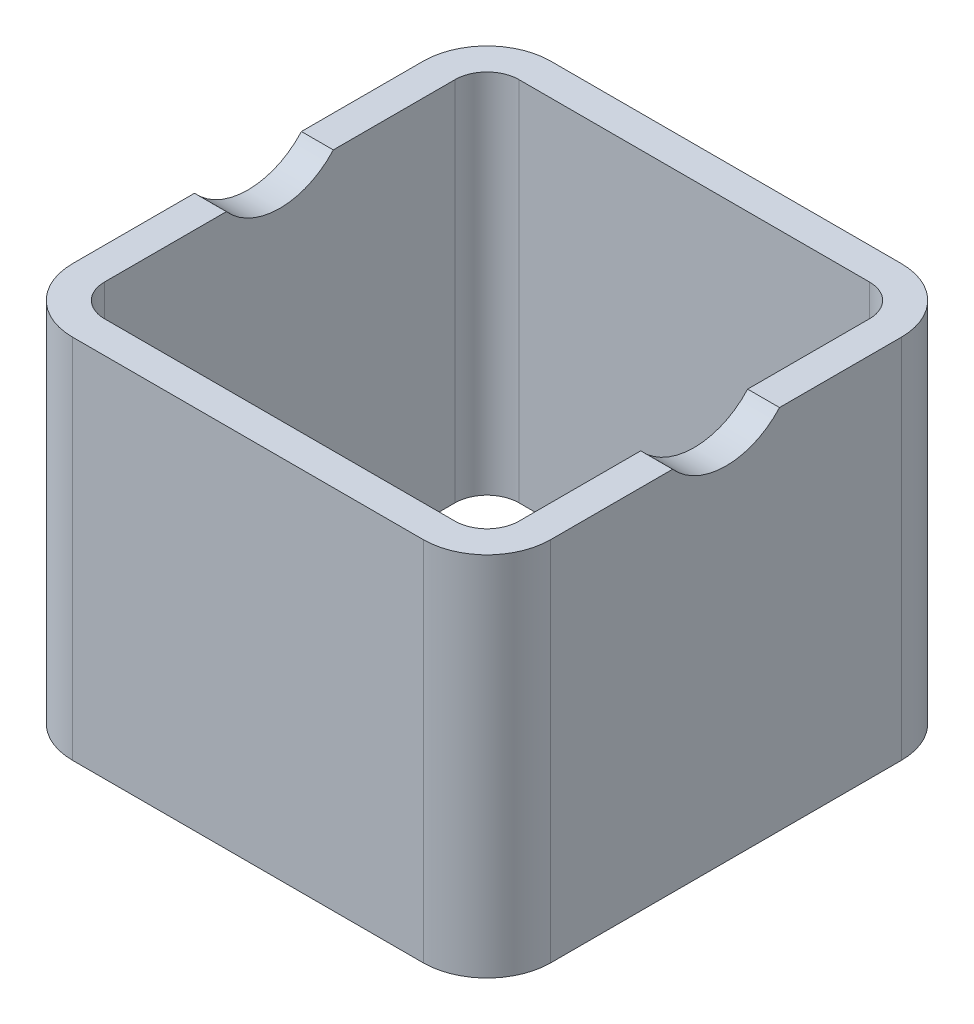
ISO-10303-21;
HEADER;
FILE_DESCRIPTION(('STEP AP214'),'2;1');
FILE_NAME('part.step','',(''),(''),'','','');
FILE_SCHEMA(('AUTOMOTIVE_DESIGN { 1 0 10303 214 1 1 1 1 }'));
ENDSEC;
DATA;
#1=APPLICATION_CONTEXT('core data for automotive mechanical design processes');
#2=APPLICATION_PROTOCOL_DEFINITION('international standard','automotive_design',2000,#1);
#3=PRODUCT_CONTEXT('',#1,'mechanical');
#4=PRODUCT('Part','Part','',(#3));
#5=PRODUCT_RELATED_PRODUCT_CATEGORY('part','',(#4));
#6=PRODUCT_DEFINITION_FORMATION('','',#4);
#7=PRODUCT_DEFINITION_CONTEXT('part definition',#1,'design');
#8=PRODUCT_DEFINITION('design','',#6,#7);
#9=PRODUCT_DEFINITION_SHAPE('','',#8);
#10=(LENGTH_UNIT() NAMED_UNIT(*) SI_UNIT(.MILLI.,.METRE.));
#11=(NAMED_UNIT(*) PLANE_ANGLE_UNIT() SI_UNIT($,.RADIAN.));
#12=(NAMED_UNIT(*) SI_UNIT($,.STERADIAN.) SOLID_ANGLE_UNIT());
#13=UNCERTAINTY_MEASURE_WITH_UNIT(LENGTH_MEASURE(1.E-05),#10,'distance_accuracy_value','');
#14=(GEOMETRIC_REPRESENTATION_CONTEXT(3) GLOBAL_UNCERTAINTY_ASSIGNED_CONTEXT((#13)) GLOBAL_UNIT_ASSIGNED_CONTEXT((#10,
#11,#12)) REPRESENTATION_CONTEXT('',''));
#15=CARTESIAN_POINT('',(0.,0.,0.));
#16=DIRECTION('',(0.,0.,1.));
#17=DIRECTION('',(1.,0.,0.));
#18=AXIS2_PLACEMENT_3D('',#15,#16,#17);
#19=CARTESIAN_POINT('',(-11.,11.5,11.));
#20=DIRECTION('',(0.,-1.,0.));
#21=DIRECTION('',(0.,0.,-1.));
#22=AXIS2_PLACEMENT_3D('',#19,#20,#21);
#23=PLANE('',#22);
#24=DIRECTION('',(0.,0.,1.));
#25=VECTOR('',#24,1.);
#26=CARTESIAN_POINT('',(-15.,11.5,11.));
#27=LINE('',#26,#25);
#28=CARTESIAN_POINT('',(-15.,11.5,-11.));
#29=VERTEX_POINT('',#28);
#30=CARTESIAN_POINT('',(-15.,11.5,-3.35410196624969));
#31=VERTEX_POINT('',#30);
#32=EDGE_CURVE('E193',#29,#31,#27,.T.);
#33=ORIENTED_EDGE('',*,*,#32,.T.);
#34=DIRECTION('',(1.,0.,0.));
#35=VECTOR('',#34,1.);
#36=CARTESIAN_POINT('',(-15.,11.5,-3.35410196624969));
#37=LINE('',#36,#35);
#38=CARTESIAN_POINT('',(-13.,11.5,-3.35410196624969));
#39=VERTEX_POINT('',#38);
#40=EDGE_CURVE('E171',#31,#39,#37,.T.);
#41=ORIENTED_EDGE('',*,*,#40,.T.);
#42=DIRECTION('',(0.,0.,1.));
#43=VECTOR('',#42,1.);
#44=CARTESIAN_POINT('',(-13.,11.5,11.));
#45=LINE('',#44,#43);
#46=CARTESIAN_POINT('',(-13.,11.5,-11.));
#47=VERTEX_POINT('',#46);
#48=EDGE_CURVE('E287',#47,#39,#45,.T.);
#49=ORIENTED_EDGE('',*,*,#48,.F.);
#50=CARTESIAN_POINT('',(-11.,11.5,-11.));
#51=DIRECTION('',(0.,1.,0.));
#52=DIRECTION('',(0.,0.,-1.));
#53=AXIS2_PLACEMENT_3D('',#50,#51,#52);
#54=CIRCLE('',#53,2.);
#55=CARTESIAN_POINT('',(-11.,11.5,-13.));
#56=VERTEX_POINT('',#55);
#57=EDGE_CURVE('E299',#56,#47,#54,.T.);
#58=ORIENTED_EDGE('',*,*,#57,.F.);
#59=DIRECTION('',(-1.,0.,0.));
#60=VECTOR('',#59,1.);
#61=CARTESIAN_POINT('',(-11.,11.5,-13.));
#62=LINE('',#61,#60);
#63=CARTESIAN_POINT('',(11.,11.5,-13.));
#64=VERTEX_POINT('',#63);
#65=EDGE_CURVE('E361',#64,#56,#62,.T.);
#66=ORIENTED_EDGE('',*,*,#65,.F.);
#67=CARTESIAN_POINT('',(11.,11.5,-11.));
#68=DIRECTION('',(0.,1.,0.));
#69=DIRECTION('',(0.,0.,-1.));
#70=AXIS2_PLACEMENT_3D('',#67,#68,#69);
#71=CIRCLE('',#70,2.);
#72=CARTESIAN_POINT('',(13.,11.5,-11.));
#73=VERTEX_POINT('',#72);
#74=EDGE_CURVE('E360',#73,#64,#71,.T.);
#75=ORIENTED_EDGE('',*,*,#74,.F.);
#76=DIRECTION('',(0.,0.,-1.));
#77=VECTOR('',#76,1.);
#78=CARTESIAN_POINT('',(13.,11.5,11.));
#79=LINE('',#78,#77);
#80=CARTESIAN_POINT('',(13.,11.5,-3.35410196624969));
#81=VERTEX_POINT('',#80);
#82=EDGE_CURVE('E356',#81,#73,#79,.T.);
#83=ORIENTED_EDGE('',*,*,#82,.F.);
#84=CARTESIAN_POINT('',(15.,11.5,-3.35410196624969));
#85=VERTEX_POINT('',#84);
#86=EDGE_CURVE('E49',#81,#85,#37,.T.);
#87=ORIENTED_EDGE('',*,*,#86,.T.);
#88=DIRECTION('',(0.,0.,-1.));
#89=VECTOR('',#88,1.);
#90=CARTESIAN_POINT('',(15.,11.5,11.));
#91=LINE('',#90,#89);
#92=CARTESIAN_POINT('',(15.,11.5,-11.));
#93=VERTEX_POINT('',#92);
#94=EDGE_CURVE('E266',#85,#93,#91,.T.);
#95=ORIENTED_EDGE('',*,*,#94,.T.);
#96=CARTESIAN_POINT('',(11.,11.5,-11.));
#97=DIRECTION('',(0.,1.,0.));
#98=DIRECTION('',(0.,0.,-1.));
#99=AXIS2_PLACEMENT_3D('',#96,#97,#98);
#100=CIRCLE('',#99,4.);
#101=CARTESIAN_POINT('',(11.,11.5,-15.));
#102=VERTEX_POINT('',#101);
#103=EDGE_CURVE('E265',#93,#102,#100,.T.);
#104=ORIENTED_EDGE('',*,*,#103,.T.);
#105=DIRECTION('',(-1.,0.,0.));
#106=VECTOR('',#105,1.);
#107=CARTESIAN_POINT('',(-11.,11.5,-15.));
#108=LINE('',#107,#106);
#109=CARTESIAN_POINT('',(-11.,11.5,-15.));
#110=VERTEX_POINT('',#109);
#111=EDGE_CURVE('E196',#102,#110,#108,.T.);
#112=ORIENTED_EDGE('',*,*,#111,.T.);
#113=CARTESIAN_POINT('',(-11.,11.5,-11.));
#114=DIRECTION('',(0.,1.,0.));
#115=DIRECTION('',(0.,0.,-1.));
#116=AXIS2_PLACEMENT_3D('',#113,#114,#115);
#117=CIRCLE('',#116,4.);
#118=EDGE_CURVE('E194',#110,#29,#117,.T.);
#119=ORIENTED_EDGE('',*,*,#118,.T.);
#120=EDGE_LOOP('',(#33,#41,#49,#58,#66,#75,#83,#87,#95,#104,#112,#119));
#121=FACE_BOUND('',#120,.T.);
#122=ADVANCED_FACE('F34',(#121),#23,.F.);
#123=CARTESIAN_POINT('',(15.,11.5,11.));
#124=VERTEX_POINT('',#123);
#125=CARTESIAN_POINT('',(15.,11.5,3.35410196624969));
#126=VERTEX_POINT('',#125);
#127=EDGE_CURVE('E263',#124,#126,#91,.T.);
#128=ORIENTED_EDGE('',*,*,#127,.T.);
#129=DIRECTION('',(1.,0.,0.));
#130=VECTOR('',#129,1.);
#131=CARTESIAN_POINT('',(-15.,11.5,3.35410196624969));
#132=LINE('',#131,#130);
#133=CARTESIAN_POINT('',(13.,11.5,3.35410196624969));
#134=VERTEX_POINT('',#133);
#135=EDGE_CURVE('E188',#126,#134,#132,.F.);
#136=ORIENTED_EDGE('',*,*,#135,.T.);
#137=CARTESIAN_POINT('',(13.,11.5,11.));
#138=VERTEX_POINT('',#137);
#139=EDGE_CURVE('E357',#138,#134,#79,.T.);
#140=ORIENTED_EDGE('',*,*,#139,.F.);
#141=CARTESIAN_POINT('',(11.,11.5,11.));
#142=DIRECTION('',(0.,1.,0.));
#143=DIRECTION('',(0.,0.,1.));
#144=AXIS2_PLACEMENT_3D('',#141,#142,#143);
#145=CIRCLE('',#144,2.);
#146=CARTESIAN_POINT('',(11.,11.5,13.));
#147=VERTEX_POINT('',#146);
#148=EDGE_CURVE('E351',#147,#138,#145,.T.);
#149=ORIENTED_EDGE('',*,*,#148,.F.);
#150=DIRECTION('',(1.,0.,0.));
#151=VECTOR('',#150,1.);
#152=CARTESIAN_POINT('',(-11.,11.5,13.));
#153=LINE('',#152,#151);
#154=CARTESIAN_POINT('',(-11.,11.5,13.));
#155=VERTEX_POINT('',#154);
#156=EDGE_CURVE('E349',#155,#147,#153,.T.);
#157=ORIENTED_EDGE('',*,*,#156,.F.);
#158=CARTESIAN_POINT('',(-11.,11.5,11.));
#159=DIRECTION('',(0.,1.,0.));
#160=DIRECTION('',(0.,0.,-1.));
#161=AXIS2_PLACEMENT_3D('',#158,#159,#160);
#162=CIRCLE('',#161,2.);
#163=CARTESIAN_POINT('',(-13.,11.5,11.));
#164=VERTEX_POINT('',#163);
#165=EDGE_CURVE('E326',#164,#155,#162,.T.);
#166=ORIENTED_EDGE('',*,*,#165,.F.);
#167=CARTESIAN_POINT('',(-13.,11.5,3.35410196624969));
#168=VERTEX_POINT('',#167);
#169=EDGE_CURVE('E186',#168,#164,#45,.T.);
#170=ORIENTED_EDGE('',*,*,#169,.F.);
#171=CARTESIAN_POINT('',(-15.,11.5,3.35410196624969));
#172=VERTEX_POINT('',#171);
#173=EDGE_CURVE('E56',#168,#172,#132,.F.);
#174=ORIENTED_EDGE('',*,*,#173,.T.);
#175=CARTESIAN_POINT('',(-15.,11.5,11.));
#176=VERTEX_POINT('',#175);
#177=EDGE_CURVE('E183',#172,#176,#27,.T.);
#178=ORIENTED_EDGE('',*,*,#177,.T.);
#179=CARTESIAN_POINT('',(-11.,11.5,11.));
#180=DIRECTION('',(0.,1.,0.));
#181=DIRECTION('',(0.,0.,-1.));
#182=AXIS2_PLACEMENT_3D('',#179,#180,#181);
#183=CIRCLE('',#182,4.);
#184=CARTESIAN_POINT('',(-11.,11.5,15.));
#185=VERTEX_POINT('',#184);
#186=EDGE_CURVE('E218',#176,#185,#183,.T.);
#187=ORIENTED_EDGE('',*,*,#186,.T.);
#188=DIRECTION('',(1.,0.,0.));
#189=VECTOR('',#188,1.);
#190=CARTESIAN_POINT('',(-11.,11.5,15.));
#191=LINE('',#190,#189);
#192=CARTESIAN_POINT('',(11.,11.5,15.));
#193=VERTEX_POINT('',#192);
#194=EDGE_CURVE('E242',#185,#193,#191,.T.);
#195=ORIENTED_EDGE('',*,*,#194,.T.);
#196=CARTESIAN_POINT('',(11.,11.5,11.));
#197=DIRECTION('',(0.,1.,0.));
#198=DIRECTION('',(0.,0.,1.));
#199=AXIS2_PLACEMENT_3D('',#196,#197,#198);
#200=CIRCLE('',#199,4.);
#201=EDGE_CURVE('E269',#193,#124,#200,.T.);
#202=ORIENTED_EDGE('',*,*,#201,.T.);
#203=EDGE_LOOP('',(#128,#136,#140,#149,#157,#166,#170,#174,#178,#187,#195,#202));
#204=FACE_BOUND('',#203,.T.);
#205=ADVANCED_FACE('F181',(#204),#23,.F.);
#206=CARTESIAN_POINT('',(-11.,-11.5,11.));
#207=DIRECTION('',(0.,-1.,0.));
#208=DIRECTION('',(0.,0.,-1.));
#209=AXIS2_PLACEMENT_3D('',#206,#207,#208);
#210=PLANE('',#209);
#211=CARTESIAN_POINT('',(-11.,-11.5,11.));
#212=DIRECTION('',(0.,1.,0.));
#213=DIRECTION('',(0.,0.,-1.));
#214=AXIS2_PLACEMENT_3D('',#211,#212,#213);
#215=CIRCLE('',#214,4.);
#216=CARTESIAN_POINT('',(-15.,-11.5,11.));
#217=VERTEX_POINT('',#216);
#218=CARTESIAN_POINT('',(-11.,-11.5,15.));
#219=VERTEX_POINT('',#218);
#220=EDGE_CURVE('E200',#217,#219,#215,.T.);
#221=ORIENTED_EDGE('',*,*,#220,.F.);
#222=DIRECTION('',(0.,0.,1.));
#223=VECTOR('',#222,1.);
#224=CARTESIAN_POINT('',(-15.,-11.5,11.));
#225=LINE('',#224,#223);
#226=CARTESIAN_POINT('',(-15.,-11.5,-11.));
#227=VERTEX_POINT('',#226);
#228=EDGE_CURVE('E216',#227,#217,#225,.T.);
#229=ORIENTED_EDGE('',*,*,#228,.F.);
#230=CARTESIAN_POINT('',(-11.,-11.5,-11.));
#231=DIRECTION('',(0.,1.,0.));
#232=DIRECTION('',(0.,0.,-1.));
#233=AXIS2_PLACEMENT_3D('',#230,#231,#232);
#234=CIRCLE('',#233,4.);
#235=CARTESIAN_POINT('',(-11.,-11.5,-15.));
#236=VERTEX_POINT('',#235);
#237=EDGE_CURVE('E214',#236,#227,#234,.T.);
#238=ORIENTED_EDGE('',*,*,#237,.F.);
#239=DIRECTION('',(-1.,0.,0.));
#240=VECTOR('',#239,1.);
#241=CARTESIAN_POINT('',(-11.,-11.5,-15.));
#242=LINE('',#241,#240);
#243=CARTESIAN_POINT('',(11.,-11.5,-15.));
#244=VERTEX_POINT('',#243);
#245=EDGE_CURVE('E212',#244,#236,#242,.T.);
#246=ORIENTED_EDGE('',*,*,#245,.F.);
#247=CARTESIAN_POINT('',(11.,-11.5,-11.));
#248=DIRECTION('',(0.,1.,0.));
#249=DIRECTION('',(0.,0.,-1.));
#250=AXIS2_PLACEMENT_3D('',#247,#248,#249);
#251=CIRCLE('',#250,4.);
#252=CARTESIAN_POINT('',(15.,-11.5,-11.));
#253=VERTEX_POINT('',#252);
#254=EDGE_CURVE('E210',#253,#244,#251,.T.);
#255=ORIENTED_EDGE('',*,*,#254,.F.);
#256=DIRECTION('',(0.,0.,-1.));
#257=VECTOR('',#256,1.);
#258=CARTESIAN_POINT('',(15.,-11.5,11.));
#259=LINE('',#258,#257);
#260=CARTESIAN_POINT('',(15.,-11.5,11.));
#261=VERTEX_POINT('',#260);
#262=EDGE_CURVE('E208',#261,#253,#259,.T.);
#263=ORIENTED_EDGE('',*,*,#262,.F.);
#264=CARTESIAN_POINT('',(11.,-11.5,11.));
#265=DIRECTION('',(0.,1.,0.));
#266=DIRECTION('',(0.,0.,1.));
#267=AXIS2_PLACEMENT_3D('',#264,#265,#266);
#268=CIRCLE('',#267,4.);
#269=CARTESIAN_POINT('',(11.,-11.5,15.));
#270=VERTEX_POINT('',#269);
#271=EDGE_CURVE('E206',#270,#261,#268,.T.);
#272=ORIENTED_EDGE('',*,*,#271,.F.);
#273=DIRECTION('',(1.,0.,0.));
#274=VECTOR('',#273,1.);
#275=CARTESIAN_POINT('',(-11.,-11.5,15.));
#276=LINE('',#275,#274);
#277=EDGE_CURVE('E203',#219,#270,#276,.T.);
#278=ORIENTED_EDGE('',*,*,#277,.F.);
#279=EDGE_LOOP('',(#221,#229,#238,#246,#255,#263,#272,#278));
#280=FACE_BOUND('',#279,.T.);
#281=DIRECTION('',(0.,0.,1.));
#282=VECTOR('',#281,1.);
#283=CARTESIAN_POINT('',(-13.,-11.5,11.));
#284=LINE('',#283,#282);
#285=CARTESIAN_POINT('',(-13.,-11.5,-11.));
#286=VERTEX_POINT('',#285);
#287=CARTESIAN_POINT('',(-13.,-11.5,11.));
#288=VERTEX_POINT('',#287);
#289=EDGE_CURVE('E324',#286,#288,#284,.T.);
#290=ORIENTED_EDGE('',*,*,#289,.T.);
#291=CARTESIAN_POINT('',(-11.,-11.5,11.));
#292=DIRECTION('',(0.,1.,0.));
#293=DIRECTION('',(0.,0.,-1.));
#294=AXIS2_PLACEMENT_3D('',#291,#292,#293);
#295=CIRCLE('',#294,2.);
#296=CARTESIAN_POINT('',(-11.,-11.5,13.));
#297=VERTEX_POINT('',#296);
#298=EDGE_CURVE('E303',#288,#297,#295,.T.);
#299=ORIENTED_EDGE('',*,*,#298,.T.);
#300=DIRECTION('',(1.,0.,0.));
#301=VECTOR('',#300,1.);
#302=CARTESIAN_POINT('',(-11.,-11.5,13.));
#303=LINE('',#302,#301);
#304=CARTESIAN_POINT('',(11.,-11.5,13.));
#305=VERTEX_POINT('',#304);
#306=EDGE_CURVE('E306',#297,#305,#303,.T.);
#307=ORIENTED_EDGE('',*,*,#306,.T.);
#308=CARTESIAN_POINT('',(11.,-11.5,11.));
#309=DIRECTION('',(0.,1.,0.));
#310=DIRECTION('',(0.,0.,1.));
#311=AXIS2_PLACEMENT_3D('',#308,#309,#310);
#312=CIRCLE('',#311,2.);
#313=CARTESIAN_POINT('',(13.,-11.5,11.));
#314=VERTEX_POINT('',#313);
#315=EDGE_CURVE('E309',#305,#314,#312,.T.);
#316=ORIENTED_EDGE('',*,*,#315,.T.);
#317=DIRECTION('',(0.,0.,-1.));
#318=VECTOR('',#317,1.);
#319=CARTESIAN_POINT('',(13.,-11.5,11.));
#320=LINE('',#319,#318);
#321=CARTESIAN_POINT('',(13.,-11.5,-11.));
#322=VERTEX_POINT('',#321);
#323=EDGE_CURVE('E312',#314,#322,#320,.T.);
#324=ORIENTED_EDGE('',*,*,#323,.T.);
#325=CARTESIAN_POINT('',(11.,-11.5,-11.));
#326=DIRECTION('',(0.,1.,0.));
#327=DIRECTION('',(0.,0.,-1.));
#328=AXIS2_PLACEMENT_3D('',#325,#326,#327);
#329=CIRCLE('',#328,2.);
#330=CARTESIAN_POINT('',(11.,-11.5,-13.));
#331=VERTEX_POINT('',#330);
#332=EDGE_CURVE('E315',#322,#331,#329,.T.);
#333=ORIENTED_EDGE('',*,*,#332,.T.);
#334=DIRECTION('',(-1.,0.,0.));
#335=VECTOR('',#334,1.);
#336=CARTESIAN_POINT('',(-11.,-11.5,-13.));
#337=LINE('',#336,#335);
#338=CARTESIAN_POINT('',(-11.,-11.5,-13.));
#339=VERTEX_POINT('',#338);
#340=EDGE_CURVE('E318',#331,#339,#337,.T.);
#341=ORIENTED_EDGE('',*,*,#340,.T.);
#342=CARTESIAN_POINT('',(-11.,-11.5,-11.));
#343=DIRECTION('',(0.,1.,0.));
#344=DIRECTION('',(0.,0.,-1.));
#345=AXIS2_PLACEMENT_3D('',#342,#343,#344);
#346=CIRCLE('',#345,2.);
#347=EDGE_CURVE('E321',#339,#286,#346,.T.);
#348=ORIENTED_EDGE('',*,*,#347,.T.);
#349=EDGE_LOOP('',(#290,#299,#307,#316,#324,#333,#341,#348));
#350=FACE_BOUND('',#349,.T.);
#351=ADVANCED_FACE('F247',(#280,#350),#210,.T.);
#352=CARTESIAN_POINT('',(-11.,11.5,11.));
#353=DIRECTION('',(0.,-1.,0.));
#354=DIRECTION('',(0.,0.,-1.));
#355=AXIS2_PLACEMENT_3D('',#352,#353,#354);
#356=CYLINDRICAL_SURFACE('',#355,4.);
#357=ORIENTED_EDGE('',*,*,#220,.T.);
#358=DIRECTION('',(0.,-1.,0.));
#359=VECTOR('',#358,1.);
#360=CARTESIAN_POINT('',(-11.,11.5,15.));
#361=LINE('',#360,#359);
#362=EDGE_CURVE('E42',#185,#219,#361,.T.);
#363=ORIENTED_EDGE('',*,*,#362,.F.);
#364=ORIENTED_EDGE('',*,*,#186,.F.);
#365=DIRECTION('',(0.,-1.,0.));
#366=VECTOR('',#365,1.);
#367=CARTESIAN_POINT('',(-15.,11.5,11.));
#368=LINE('',#367,#366);
#369=EDGE_CURVE('E191',#176,#217,#368,.T.);
#370=ORIENTED_EDGE('',*,*,#369,.T.);
#371=EDGE_LOOP('',(#357,#363,#364,#370));
#372=FACE_BOUND('',#371,.T.);
#373=ADVANCED_FACE('F36',(#372),#356,.T.);
#374=CARTESIAN_POINT('',(-11.,11.5,15.));
#375=DIRECTION('',(0.,0.,-1.));
#376=DIRECTION('',(-1.,0.,0.));
#377=AXIS2_PLACEMENT_3D('',#374,#375,#376);
#378=PLANE('',#377);
#379=ORIENTED_EDGE('',*,*,#277,.T.);
#380=DIRECTION('',(0.,-1.,0.));
#381=VECTOR('',#380,1.);
#382=CARTESIAN_POINT('',(11.,11.5,15.));
#383=LINE('',#382,#381);
#384=EDGE_CURVE('E235',#193,#270,#383,.T.);
#385=ORIENTED_EDGE('',*,*,#384,.F.);
#386=ORIENTED_EDGE('',*,*,#194,.F.);
#387=ORIENTED_EDGE('',*,*,#362,.T.);
#388=EDGE_LOOP('',(#379,#385,#386,#387));
#389=FACE_BOUND('',#388,.T.);
#390=ADVANCED_FACE('F240',(#389),#378,.F.);
#391=CARTESIAN_POINT('',(11.,11.5,11.));
#392=DIRECTION('',(0.,-1.,0.));
#393=DIRECTION('',(0.,0.,-1.));
#394=AXIS2_PLACEMENT_3D('',#391,#392,#393);
#395=CYLINDRICAL_SURFACE('',#394,4.);
#396=ORIENTED_EDGE('',*,*,#271,.T.);
#397=DIRECTION('',(0.,-1.,0.));
#398=VECTOR('',#397,1.);
#399=CARTESIAN_POINT('',(15.,11.5,11.));
#400=LINE('',#399,#398);
#401=EDGE_CURVE('E232',#124,#261,#400,.T.);
#402=ORIENTED_EDGE('',*,*,#401,.F.);
#403=ORIENTED_EDGE('',*,*,#201,.F.);
#404=ORIENTED_EDGE('',*,*,#384,.T.);
#405=EDGE_LOOP('',(#396,#402,#403,#404));
#406=FACE_BOUND('',#405,.T.);
#407=ADVANCED_FACE('F255',(#406),#395,.T.);
#408=CARTESIAN_POINT('',(15.,11.5,11.));
#409=DIRECTION('',(-1.,0.,0.));
#410=DIRECTION('',(0.,0.,1.));
#411=AXIS2_PLACEMENT_3D('',#408,#409,#410);
#412=PLANE('',#411);
#413=ORIENTED_EDGE('',*,*,#94,.F.);
#414=CARTESIAN_POINT('',(15.,14.5,0.));
#415=DIRECTION('',(1.,0.,0.));
#416=DIRECTION('',(0.,0.,-1.));
#417=AXIS2_PLACEMENT_3D('',#414,#415,#416);
#418=CIRCLE('',#417,4.5);
#419=EDGE_CURVE('E176',#126,#85,#418,.T.);
#420=ORIENTED_EDGE('',*,*,#419,.F.);
#421=ORIENTED_EDGE('',*,*,#127,.F.);
#422=ORIENTED_EDGE('',*,*,#401,.T.);
#423=ORIENTED_EDGE('',*,*,#262,.T.);
#424=DIRECTION('',(0.,-1.,0.));
#425=VECTOR('',#424,1.);
#426=CARTESIAN_POINT('',(15.,11.5,-11.));
#427=LINE('',#426,#425);
#428=EDGE_CURVE('E229',#93,#253,#427,.T.);
#429=ORIENTED_EDGE('',*,*,#428,.F.);
#430=EDGE_LOOP('',(#413,#420,#421,#422,#423,#429));
#431=FACE_BOUND('',#430,.T.);
#432=ADVANCED_FACE('F260',(#431),#412,.F.);
#433=CARTESIAN_POINT('',(11.,11.5,-11.));
#434=DIRECTION('',(0.,-1.,0.));
#435=DIRECTION('',(0.,0.,-1.));
#436=AXIS2_PLACEMENT_3D('',#433,#434,#435);
#437=CYLINDRICAL_SURFACE('',#436,4.);
#438=ORIENTED_EDGE('',*,*,#254,.T.);
#439=DIRECTION('',(0.,-1.,0.));
#440=VECTOR('',#439,1.);
#441=CARTESIAN_POINT('',(11.,11.5,-15.));
#442=LINE('',#441,#440);
#443=EDGE_CURVE('E226',#102,#244,#442,.T.);
#444=ORIENTED_EDGE('',*,*,#443,.F.);
#445=ORIENTED_EDGE('',*,*,#103,.F.);
#446=ORIENTED_EDGE('',*,*,#428,.T.);
#447=EDGE_LOOP('',(#438,#444,#445,#446));
#448=FACE_BOUND('',#447,.T.);
#449=ADVANCED_FACE('F385',(#448),#437,.T.);
#450=CARTESIAN_POINT('',(-11.,11.5,-15.));
#451=DIRECTION('',(0.,0.,1.));
#452=DIRECTION('',(1.,0.,0.));
#453=AXIS2_PLACEMENT_3D('',#450,#451,#452);
#454=PLANE('',#453);
#455=ORIENTED_EDGE('',*,*,#245,.T.);
#456=DIRECTION('',(0.,-1.,0.));
#457=VECTOR('',#456,1.);
#458=CARTESIAN_POINT('',(-11.,11.5,-15.));
#459=LINE('',#458,#457);
#460=EDGE_CURVE('E223',#110,#236,#459,.T.);
#461=ORIENTED_EDGE('',*,*,#460,.F.);
#462=ORIENTED_EDGE('',*,*,#111,.F.);
#463=ORIENTED_EDGE('',*,*,#443,.T.);
#464=EDGE_LOOP('',(#455,#461,#462,#463));
#465=FACE_BOUND('',#464,.T.);
#466=ADVANCED_FACE('F280',(#465),#454,.F.);
#467=CARTESIAN_POINT('',(-11.,11.5,-11.));
#468=DIRECTION('',(0.,-1.,0.));
#469=DIRECTION('',(0.,0.,-1.));
#470=AXIS2_PLACEMENT_3D('',#467,#468,#469);
#471=CYLINDRICAL_SURFACE('',#470,4.);
#472=ORIENTED_EDGE('',*,*,#237,.T.);
#473=DIRECTION('',(0.,-1.,0.));
#474=VECTOR('',#473,1.);
#475=CARTESIAN_POINT('',(-15.,11.5,-11.));
#476=LINE('',#475,#474);
#477=EDGE_CURVE('E220',#29,#227,#476,.T.);
#478=ORIENTED_EDGE('',*,*,#477,.F.);
#479=ORIENTED_EDGE('',*,*,#118,.F.);
#480=ORIENTED_EDGE('',*,*,#460,.T.);
#481=EDGE_LOOP('',(#472,#478,#479,#480));
#482=FACE_BOUND('',#481,.T.);
#483=ADVANCED_FACE('F283',(#482),#471,.T.);
#484=CARTESIAN_POINT('',(-15.,11.5,11.));
#485=DIRECTION('',(1.,0.,0.));
#486=DIRECTION('',(0.,0.,-1.));
#487=AXIS2_PLACEMENT_3D('',#484,#485,#486);
#488=PLANE('',#487);
#489=ORIENTED_EDGE('',*,*,#177,.F.);
#490=CARTESIAN_POINT('',(-15.,14.5,0.));
#491=DIRECTION('',(1.,0.,0.));
#492=DIRECTION('',(0.,0.,-1.));
#493=AXIS2_PLACEMENT_3D('',#490,#491,#492);
#494=CIRCLE('',#493,4.5);
#495=EDGE_CURVE('E168',#172,#31,#494,.T.);
#496=ORIENTED_EDGE('',*,*,#495,.T.);
#497=ORIENTED_EDGE('',*,*,#32,.F.);
#498=ORIENTED_EDGE('',*,*,#477,.T.);
#499=ORIENTED_EDGE('',*,*,#228,.T.);
#500=ORIENTED_EDGE('',*,*,#369,.F.);
#501=EDGE_LOOP('',(#489,#496,#497,#498,#499,#500));
#502=FACE_BOUND('',#501,.T.);
#503=ADVANCED_FACE('F189',(#502),#488,.F.);
#504=CARTESIAN_POINT('',(-11.,11.5,11.));
#505=DIRECTION('',(0.,-1.,0.));
#506=DIRECTION('',(0.,0.,-1.));
#507=AXIS2_PLACEMENT_3D('',#504,#505,#506);
#508=CYLINDRICAL_SURFACE('',#507,2.);
#509=ORIENTED_EDGE('',*,*,#298,.F.);
#510=DIRECTION('',(0.,-1.,0.));
#511=VECTOR('',#510,1.);
#512=CARTESIAN_POINT('',(-13.,11.5,11.));
#513=LINE('',#512,#511);
#514=EDGE_CURVE('E295',#164,#288,#513,.T.);
#515=ORIENTED_EDGE('',*,*,#514,.F.);
#516=ORIENTED_EDGE('',*,*,#165,.T.);
#517=DIRECTION('',(0.,-1.,0.));
#518=VECTOR('',#517,1.);
#519=CARTESIAN_POINT('',(-11.,11.5,13.));
#520=LINE('',#519,#518);
#521=EDGE_CURVE('E204',#155,#297,#520,.T.);
#522=ORIENTED_EDGE('',*,*,#521,.T.);
#523=EDGE_LOOP('',(#509,#515,#516,#522));
#524=FACE_BOUND('',#523,.T.);
#525=ADVANCED_FACE('F343',(#524),#508,.F.);
#526=CARTESIAN_POINT('',(-11.,11.5,13.));
#527=DIRECTION('',(0.,0.,-1.));
#528=DIRECTION('',(-1.,0.,0.));
#529=AXIS2_PLACEMENT_3D('',#526,#527,#528);
#530=PLANE('',#529);
#531=ORIENTED_EDGE('',*,*,#306,.F.);
#532=ORIENTED_EDGE('',*,*,#521,.F.);
#533=ORIENTED_EDGE('',*,*,#156,.T.);
#534=DIRECTION('',(0.,-1.,0.));
#535=VECTOR('',#534,1.);
#536=CARTESIAN_POINT('',(11.,11.5,13.));
#537=LINE('',#536,#535);
#538=EDGE_CURVE('E337',#147,#305,#537,.T.);
#539=ORIENTED_EDGE('',*,*,#538,.T.);
#540=EDGE_LOOP('',(#531,#532,#533,#539));
#541=FACE_BOUND('',#540,.T.);
#542=ADVANCED_FACE('F423',(#541),#530,.T.);
#543=CARTESIAN_POINT('',(11.,11.5,11.));
#544=DIRECTION('',(0.,-1.,0.));
#545=DIRECTION('',(0.,0.,-1.));
#546=AXIS2_PLACEMENT_3D('',#543,#544,#545);
#547=CYLINDRICAL_SURFACE('',#546,2.);
#548=ORIENTED_EDGE('',*,*,#315,.F.);
#549=ORIENTED_EDGE('',*,*,#538,.F.);
#550=ORIENTED_EDGE('',*,*,#148,.T.);
#551=DIRECTION('',(0.,-1.,0.));
#552=VECTOR('',#551,1.);
#553=CARTESIAN_POINT('',(13.,11.5,11.));
#554=LINE('',#553,#552);
#555=EDGE_CURVE('E335',#138,#314,#554,.T.);
#556=ORIENTED_EDGE('',*,*,#555,.T.);
#557=EDGE_LOOP('',(#548,#549,#550,#556));
#558=FACE_BOUND('',#557,.T.);
#559=ADVANCED_FACE('F429',(#558),#547,.F.);
#560=CARTESIAN_POINT('',(13.,11.5,11.));
#561=DIRECTION('',(-1.,0.,0.));
#562=DIRECTION('',(0.,0.,1.));
#563=AXIS2_PLACEMENT_3D('',#560,#561,#562);
#564=PLANE('',#563);
#565=CARTESIAN_POINT('',(13.,14.5,0.));
#566=DIRECTION('',(-1.,0.,0.));
#567=DIRECTION('',(0.,0.,1.));
#568=AXIS2_PLACEMENT_3D('',#565,#566,#567);
#569=CIRCLE('',#568,4.5);
#570=EDGE_CURVE('E288',#81,#134,#569,.T.);
#571=ORIENTED_EDGE('',*,*,#570,.F.);
#572=ORIENTED_EDGE('',*,*,#82,.T.);
#573=DIRECTION('',(0.,-1.,0.));
#574=VECTOR('',#573,1.);
#575=CARTESIAN_POINT('',(13.,11.5,-11.));
#576=LINE('',#575,#574);
#577=EDGE_CURVE('E333',#73,#322,#576,.T.);
#578=ORIENTED_EDGE('',*,*,#577,.T.);
#579=ORIENTED_EDGE('',*,*,#323,.F.);
#580=ORIENTED_EDGE('',*,*,#555,.F.);
#581=ORIENTED_EDGE('',*,*,#139,.T.);
#582=EDGE_LOOP('',(#571,#572,#578,#579,#580,#581));
#583=FACE_BOUND('',#582,.T.);
#584=ADVANCED_FACE('F380',(#583),#564,.T.);
#585=CARTESIAN_POINT('',(11.,11.5,-11.));
#586=DIRECTION('',(0.,-1.,0.));
#587=DIRECTION('',(0.,0.,-1.));
#588=AXIS2_PLACEMENT_3D('',#585,#586,#587);
#589=CYLINDRICAL_SURFACE('',#588,2.);
#590=ORIENTED_EDGE('',*,*,#332,.F.);
#591=ORIENTED_EDGE('',*,*,#577,.F.);
#592=ORIENTED_EDGE('',*,*,#74,.T.);
#593=DIRECTION('',(0.,-1.,0.));
#594=VECTOR('',#593,1.);
#595=CARTESIAN_POINT('',(11.,11.5,-13.));
#596=LINE('',#595,#594);
#597=EDGE_CURVE('E331',#64,#331,#596,.T.);
#598=ORIENTED_EDGE('',*,*,#597,.T.);
#599=EDGE_LOOP('',(#590,#591,#592,#598));
#600=FACE_BOUND('',#599,.T.);
#601=ADVANCED_FACE('F373',(#600),#589,.F.);
#602=CARTESIAN_POINT('',(-11.,11.5,-13.));
#603=DIRECTION('',(0.,0.,1.));
#604=DIRECTION('',(1.,0.,0.));
#605=AXIS2_PLACEMENT_3D('',#602,#603,#604);
#606=PLANE('',#605);
#607=ORIENTED_EDGE('',*,*,#340,.F.);
#608=ORIENTED_EDGE('',*,*,#597,.F.);
#609=ORIENTED_EDGE('',*,*,#65,.T.);
#610=DIRECTION('',(0.,-1.,0.));
#611=VECTOR('',#610,1.);
#612=CARTESIAN_POINT('',(-11.,11.5,-13.));
#613=LINE('',#612,#611);
#614=EDGE_CURVE('E329',#56,#339,#613,.T.);
#615=ORIENTED_EDGE('',*,*,#614,.T.);
#616=EDGE_LOOP('',(#607,#608,#609,#615));
#617=FACE_BOUND('',#616,.T.);
#618=ADVANCED_FACE('F375',(#617),#606,.T.);
#619=CARTESIAN_POINT('',(-11.,11.5,-11.));
#620=DIRECTION('',(0.,-1.,0.));
#621=DIRECTION('',(0.,0.,-1.));
#622=AXIS2_PLACEMENT_3D('',#619,#620,#621);
#623=CYLINDRICAL_SURFACE('',#622,2.);
#624=ORIENTED_EDGE('',*,*,#347,.F.);
#625=ORIENTED_EDGE('',*,*,#614,.F.);
#626=ORIENTED_EDGE('',*,*,#57,.T.);
#627=DIRECTION('',(0.,-1.,0.));
#628=VECTOR('',#627,1.);
#629=CARTESIAN_POINT('',(-13.,11.5,-11.));
#630=LINE('',#629,#628);
#631=EDGE_CURVE('E293',#47,#286,#630,.T.);
#632=ORIENTED_EDGE('',*,*,#631,.T.);
#633=EDGE_LOOP('',(#624,#625,#626,#632));
#634=FACE_BOUND('',#633,.T.);
#635=ADVANCED_FACE('F367',(#634),#623,.F.);
#636=CARTESIAN_POINT('',(-13.,11.5,11.));
#637=DIRECTION('',(1.,0.,0.));
#638=DIRECTION('',(0.,0.,-1.));
#639=AXIS2_PLACEMENT_3D('',#636,#637,#638);
#640=PLANE('',#639);
#641=CARTESIAN_POINT('',(-13.,14.5,0.));
#642=DIRECTION('',(1.,0.,0.));
#643=DIRECTION('',(0.,0.,-1.));
#644=AXIS2_PLACEMENT_3D('',#641,#642,#643);
#645=CIRCLE('',#644,4.5);
#646=EDGE_CURVE('E11',#168,#39,#645,.T.);
#647=ORIENTED_EDGE('',*,*,#646,.F.);
#648=ORIENTED_EDGE('',*,*,#169,.T.);
#649=ORIENTED_EDGE('',*,*,#514,.T.);
#650=ORIENTED_EDGE('',*,*,#289,.F.);
#651=ORIENTED_EDGE('',*,*,#631,.F.);
#652=ORIENTED_EDGE('',*,*,#48,.T.);
#653=EDGE_LOOP('',(#647,#648,#649,#650,#651,#652));
#654=FACE_BOUND('',#653,.T.);
#655=ADVANCED_FACE('F291',(#654),#640,.T.);
#656=CARTESIAN_POINT('',(-15.,14.5,0.));
#657=DIRECTION('',(1.,0.,0.));
#658=DIRECTION('',(0.,0.,-1.));
#659=AXIS2_PLACEMENT_3D('',#656,#657,#658);
#660=CYLINDRICAL_SURFACE('',#659,4.5);
#661=ORIENTED_EDGE('',*,*,#495,.F.);
#662=ORIENTED_EDGE('',*,*,#173,.F.);
#663=ORIENTED_EDGE('',*,*,#646,.T.);
#664=ORIENTED_EDGE('',*,*,#40,.F.);
#665=EDGE_LOOP('',(#661,#662,#663,#664));
#666=FACE_BOUND('',#665,.T.);
#667=ADVANCED_FACE('F169',(#666),#660,.F.);
#668=ORIENTED_EDGE('',*,*,#570,.T.);
#669=ORIENTED_EDGE('',*,*,#135,.F.);
#670=ORIENTED_EDGE('',*,*,#419,.T.);
#671=ORIENTED_EDGE('',*,*,#86,.F.);
#672=EDGE_LOOP('',(#668,#669,#670,#671));
#673=FACE_BOUND('',#672,.T.);
#674=ADVANCED_FACE('F383',(#673),#660,.F.);
#675=CLOSED_SHELL('',(#122,#205,#351,#373,#390,#407,#432,#449,#466,#483,#503,#525,#542,#559,
#584,#601,#618,#635,#655,#667,#674));
#676=MANIFOLD_SOLID_BREP('B2',#675);
#677=ADVANCED_BREP_SHAPE_REPRESENTATION('',(#18,#676),#14);
#678=SHAPE_DEFINITION_REPRESENTATION(#9,#677);
ENDSEC;
END-ISO-10303-21;
